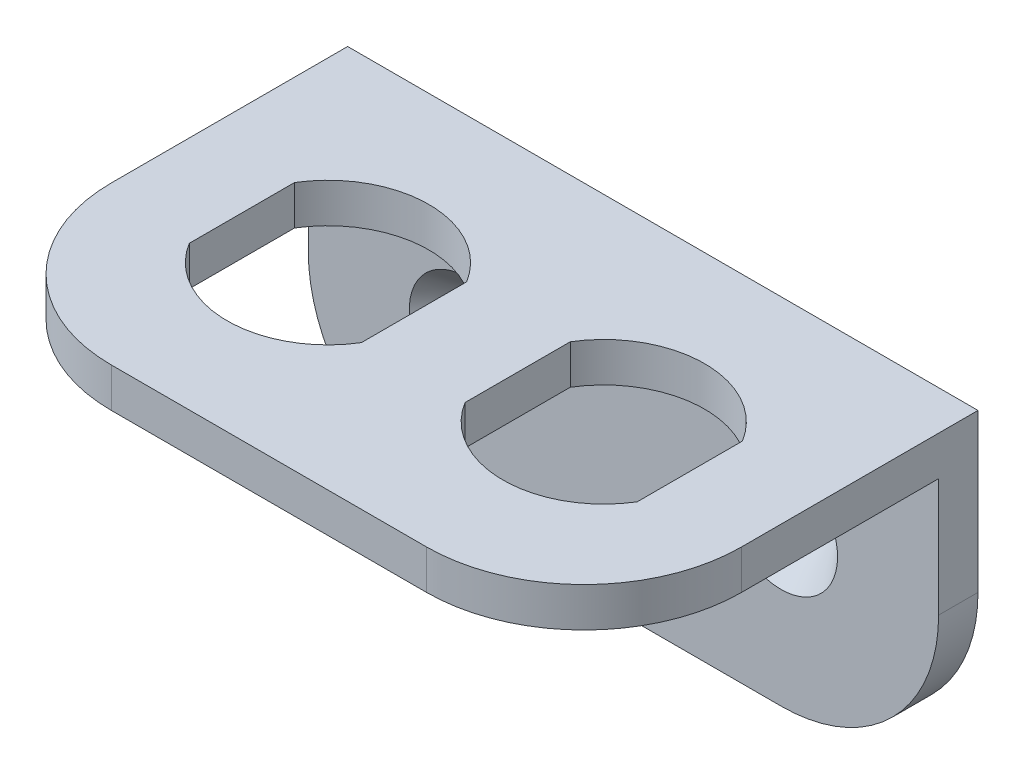
ISO-10303-21;
HEADER;
FILE_DESCRIPTION(('STEP AP214'),'2;1');
FILE_NAME('part.step','',(''),(''),'','','');
FILE_SCHEMA(('AUTOMOTIVE_DESIGN { 1 0 10303 214 1 1 1 1 }'));
ENDSEC;
DATA;
#1=APPLICATION_CONTEXT('core data for automotive mechanical design processes');
#2=APPLICATION_PROTOCOL_DEFINITION('international standard','automotive_design',2000,#1);
#3=PRODUCT_CONTEXT('',#1,'mechanical');
#4=PRODUCT('Part','Part','',(#3));
#5=PRODUCT_RELATED_PRODUCT_CATEGORY('part','',(#4));
#6=PRODUCT_DEFINITION_FORMATION('','',#4);
#7=PRODUCT_DEFINITION_CONTEXT('part definition',#1,'design');
#8=PRODUCT_DEFINITION('design','',#6,#7);
#9=PRODUCT_DEFINITION_SHAPE('','',#8);
#10=(LENGTH_UNIT() NAMED_UNIT(*) SI_UNIT(.MILLI.,.METRE.));
#11=(NAMED_UNIT(*) PLANE_ANGLE_UNIT() SI_UNIT($,.RADIAN.));
#12=(NAMED_UNIT(*) SI_UNIT($,.STERADIAN.) SOLID_ANGLE_UNIT());
#13=UNCERTAINTY_MEASURE_WITH_UNIT(LENGTH_MEASURE(1.E-05),#10,'distance_accuracy_value','');
#14=(GEOMETRIC_REPRESENTATION_CONTEXT(3) GLOBAL_UNCERTAINTY_ASSIGNED_CONTEXT((#13)) GLOBAL_UNIT_ASSIGNED_CONTEXT((#10,
#11,#12)) REPRESENTATION_CONTEXT('',''));
#15=CARTESIAN_POINT('',(0.,0.,0.));
#16=DIRECTION('',(0.,0.,1.));
#17=DIRECTION('',(1.,0.,0.));
#18=AXIS2_PLACEMENT_3D('',#15,#16,#17);
#19=CARTESIAN_POINT('',(50.8,-3.175,3.175));
#20=DIRECTION('',(0.,0.,-1.));
#21=DIRECTION('',(0.,1.,0.));
#22=AXIS2_PLACEMENT_3D('',#19,#20,#21);
#23=PLANE('',#22);
#24=CARTESIAN_POINT('',(38.1,-12.7000000000001,3.175));
#25=DIRECTION('',(0.,0.,1.));
#26=DIRECTION('',(1.,0.,0.));
#27=AXIS2_PLACEMENT_3D('',#24,#25,#26);
#28=CIRCLE('',#27,4.5593);
#29=CARTESIAN_POINT('',(42.6593,-12.7000000000001,3.175));
#30=VERTEX_POINT('',#29);
#31=EDGE_CURVE('E440',#30,#30,#28,.T.);
#32=ORIENTED_EDGE('',*,*,#31,.F.);
#33=EDGE_LOOP('',(#32));
#34=FACE_BOUND('',#33,.T.);
#35=DIRECTION('',(0.,-1.,0.));
#36=VECTOR('',#35,1.);
#37=CARTESIAN_POINT('',(0.,-3.175,3.175));
#38=LINE('',#37,#36);
#39=CARTESIAN_POINT('',(0.,-3.175,3.175));
#40=VERTEX_POINT('',#39);
#41=CARTESIAN_POINT('',(0.,-12.7,3.175));
#42=VERTEX_POINT('',#41);
#43=EDGE_CURVE('E220',#40,#42,#38,.T.);
#44=ORIENTED_EDGE('',*,*,#43,.T.);
#45=CARTESIAN_POINT('',(12.7,-12.7,3.175));
#46=DIRECTION('',(0.,0.,-1.));
#47=DIRECTION('',(0.,1.,0.));
#48=AXIS2_PLACEMENT_3D('',#45,#46,#47);
#49=CIRCLE('',#48,12.7);
#50=CARTESIAN_POINT('',(12.7,-25.4,3.175));
#51=VERTEX_POINT('',#50);
#52=EDGE_CURVE('E288',#42,#51,#49,.F.);
#53=ORIENTED_EDGE('',*,*,#52,.T.);
#54=DIRECTION('',(-1.,0.,0.));
#55=VECTOR('',#54,1.);
#56=CARTESIAN_POINT('',(50.8,-25.4,3.175));
#57=LINE('',#56,#55);
#58=CARTESIAN_POINT('',(38.1,-25.4,3.175));
#59=VERTEX_POINT('',#58);
#60=EDGE_CURVE('E238',#59,#51,#57,.T.);
#61=ORIENTED_EDGE('',*,*,#60,.F.);
#62=CARTESIAN_POINT('',(38.1,-12.7,3.175));
#63=DIRECTION('',(0.,0.,-1.));
#64=DIRECTION('',(0.,1.,0.));
#65=AXIS2_PLACEMENT_3D('',#62,#63,#64);
#66=CIRCLE('',#65,12.7);
#67=CARTESIAN_POINT('',(50.8,-12.7,3.175));
#68=VERTEX_POINT('',#67);
#69=EDGE_CURVE('E286',#59,#68,#66,.F.);
#70=ORIENTED_EDGE('',*,*,#69,.T.);
#71=DIRECTION('',(0.,-1.,0.));
#72=VECTOR('',#71,1.);
#73=CARTESIAN_POINT('',(50.8,-3.175,3.175));
#74=LINE('',#73,#72);
#75=CARTESIAN_POINT('',(50.8,-3.175,3.175));
#76=VERTEX_POINT('',#75);
#77=EDGE_CURVE('E225',#76,#68,#74,.T.);
#78=ORIENTED_EDGE('',*,*,#77,.F.);
#79=DIRECTION('',(-1.,0.,0.));
#80=VECTOR('',#79,1.);
#81=CARTESIAN_POINT('',(50.8,-3.175,3.175));
#82=LINE('',#81,#80);
#83=EDGE_CURVE('E241',#76,#40,#82,.T.);
#84=ORIENTED_EDGE('',*,*,#83,.T.);
#85=EDGE_LOOP('',(#44,#53,#61,#70,#78,#84));
#86=FACE_BOUND('',#85,.T.);
#87=CARTESIAN_POINT('',(12.7,-12.7000000000001,3.175));
#88=DIRECTION('',(0.,0.,1.));
#89=DIRECTION('',(1.,0.,0.));
#90=AXIS2_PLACEMENT_3D('',#87,#88,#89);
#91=CIRCLE('',#90,4.5593);
#92=CARTESIAN_POINT('',(17.2593,-12.7000000000001,3.175));
#93=VERTEX_POINT('',#92);
#94=EDGE_CURVE('E433',#93,#93,#91,.T.);
#95=ORIENTED_EDGE('',*,*,#94,.F.);
#96=EDGE_LOOP('',(#95));
#97=FACE_BOUND('',#96,.T.);
#98=ADVANCED_FACE('F36',(#34,#86,#97),#23,.F.);
#99=CARTESIAN_POINT('',(50.8,-25.4,0.));
#100=DIRECTION('',(0.,0.,1.));
#101=DIRECTION('',(1.,0.,0.));
#102=AXIS2_PLACEMENT_3D('',#99,#100,#101);
#103=PLANE('',#102);
#104=CARTESIAN_POINT('',(12.7,-12.7000000000001,0.));
#105=DIRECTION('',(0.,0.,1.));
#106=DIRECTION('',(1.,0.,0.));
#107=AXIS2_PLACEMENT_3D('',#104,#105,#106);
#108=CIRCLE('',#107,2.2479);
#109=CARTESIAN_POINT('',(14.9479,-12.7000000000001,0.));
#110=VERTEX_POINT('',#109);
#111=EDGE_CURVE('E435',#110,#110,#108,.T.);
#112=ORIENTED_EDGE('',*,*,#111,.T.);
#113=EDGE_LOOP('',(#112));
#114=FACE_BOUND('',#113,.T.);
#115=CARTESIAN_POINT('',(38.1,-12.7000000000001,0.));
#116=DIRECTION('',(0.,0.,1.));
#117=DIRECTION('',(1.,0.,0.));
#118=AXIS2_PLACEMENT_3D('',#115,#116,#117);
#119=CIRCLE('',#118,2.2479);
#120=CARTESIAN_POINT('',(40.3479,-12.7000000000001,0.));
#121=VERTEX_POINT('',#120);
#122=EDGE_CURVE('E446',#121,#121,#119,.T.);
#123=ORIENTED_EDGE('',*,*,#122,.T.);
#124=EDGE_LOOP('',(#123));
#125=FACE_BOUND('',#124,.T.);
#126=DIRECTION('',(-1.,0.,0.));
#127=VECTOR('',#126,1.);
#128=CARTESIAN_POINT('',(50.8,-25.4,0.));
#129=LINE('',#128,#127);
#130=CARTESIAN_POINT('',(38.1,-25.4,0.));
#131=VERTEX_POINT('',#130);
#132=CARTESIAN_POINT('',(12.7,-25.4,0.));
#133=VERTEX_POINT('',#132);
#134=EDGE_CURVE('E228',#131,#133,#129,.T.);
#135=ORIENTED_EDGE('',*,*,#134,.T.);
#136=CARTESIAN_POINT('',(12.7,-12.7,0.));
#137=DIRECTION('',(0.,0.,1.));
#138=DIRECTION('',(1.,0.,0.));
#139=AXIS2_PLACEMENT_3D('',#136,#137,#138);
#140=CIRCLE('',#139,12.7);
#141=CARTESIAN_POINT('',(0.,-12.7,0.));
#142=VERTEX_POINT('',#141);
#143=EDGE_CURVE('E280',#133,#142,#140,.F.);
#144=ORIENTED_EDGE('',*,*,#143,.T.);
#145=DIRECTION('',(0.,1.,0.));
#146=VECTOR('',#145,1.);
#147=CARTESIAN_POINT('',(0.,-25.4,0.));
#148=LINE('',#147,#146);
#149=CARTESIAN_POINT('',(0.,0.,0.));
#150=VERTEX_POINT('',#149);
#151=EDGE_CURVE('E210',#142,#150,#148,.T.);
#152=ORIENTED_EDGE('',*,*,#151,.T.);
#153=DIRECTION('',(-1.,0.,0.));
#154=VECTOR('',#153,1.);
#155=CARTESIAN_POINT('',(50.8,0.,0.));
#156=LINE('',#155,#154);
#157=CARTESIAN_POINT('',(50.8,0.,0.));
#158=VERTEX_POINT('',#157);
#159=EDGE_CURVE('E249',#158,#150,#156,.T.);
#160=ORIENTED_EDGE('',*,*,#159,.F.);
#161=DIRECTION('',(0.,1.,0.));
#162=VECTOR('',#161,1.);
#163=CARTESIAN_POINT('',(50.8,-25.4,0.));
#164=LINE('',#163,#162);
#165=CARTESIAN_POINT('',(50.8,-12.7,0.));
#166=VERTEX_POINT('',#165);
#167=EDGE_CURVE('E217',#166,#158,#164,.T.);
#168=ORIENTED_EDGE('',*,*,#167,.F.);
#169=CARTESIAN_POINT('',(38.1,-12.7,0.));
#170=DIRECTION('',(0.,0.,1.));
#171=DIRECTION('',(1.,0.,0.));
#172=AXIS2_PLACEMENT_3D('',#169,#170,#171);
#173=CIRCLE('',#172,12.7);
#174=EDGE_CURVE('E278',#166,#131,#173,.F.);
#175=ORIENTED_EDGE('',*,*,#174,.T.);
#176=EDGE_LOOP('',(#135,#144,#152,#160,#168,#175));
#177=FACE_BOUND('',#176,.T.);
#178=ADVANCED_FACE('F321',(#114,#125,#177),#103,.F.);
#179=CARTESIAN_POINT('',(50.8,0.,0.));
#180=DIRECTION('',(0.,-1.,0.));
#181=DIRECTION('',(0.,0.,-1.));
#182=AXIS2_PLACEMENT_3D('',#179,#180,#181);
#183=PLANE('',#182);
#184=DIRECTION('',(0.,0.,1.));
#185=VECTOR('',#184,1.);
#186=CARTESIAN_POINT('',(29.5783,0.,11.6345690832181));
#187=LINE('',#186,#185);
#188=CARTESIAN_POINT('',(29.5783,0.,11.6345690832181));
#189=VERTEX_POINT('',#188);
#190=CARTESIAN_POINT('',(29.5783,0.,20.1154309167819));
#191=VERTEX_POINT('',#190);
#192=EDGE_CURVE('E177',#189,#191,#187,.T.);
#193=ORIENTED_EDGE('',*,*,#192,.F.);
#194=CARTESIAN_POINT('',(36.5125,0.,15.875));
#195=DIRECTION('',(0.,1.,0.));
#196=DIRECTION('',(0.,0.,1.));
#197=AXIS2_PLACEMENT_3D('',#194,#195,#196);
#198=CIRCLE('',#197,8.128);
#199=CARTESIAN_POINT('',(43.4467,0.,11.6345690832181));
#200=VERTEX_POINT('',#199);
#201=EDGE_CURVE('E182',#200,#189,#198,.T.);
#202=ORIENTED_EDGE('',*,*,#201,.F.);
#203=DIRECTION('',(0.,0.,-1.));
#204=VECTOR('',#203,1.);
#205=CARTESIAN_POINT('',(43.4467,0.,11.6345690832181));
#206=LINE('',#205,#204);
#207=CARTESIAN_POINT('',(43.4467,0.,20.1154309167819));
#208=VERTEX_POINT('',#207);
#209=EDGE_CURVE('E187',#208,#200,#206,.T.);
#210=ORIENTED_EDGE('',*,*,#209,.F.);
#211=CARTESIAN_POINT('',(36.5125,0.,15.875));
#212=DIRECTION('',(0.,1.,0.));
#213=DIRECTION('',(0.,0.,1.));
#214=AXIS2_PLACEMENT_3D('',#211,#212,#213);
#215=CIRCLE('',#214,8.128);
#216=EDGE_CURVE('E166',#191,#208,#215,.T.);
#217=ORIENTED_EDGE('',*,*,#216,.F.);
#218=EDGE_LOOP('',(#193,#202,#210,#217));
#219=FACE_BOUND('',#218,.T.);
#220=DIRECTION('',(0.,0.,1.));
#221=VECTOR('',#220,1.);
#222=CARTESIAN_POINT('',(7.3533,0.,11.6345690832181));
#223=LINE('',#222,#221);
#224=CARTESIAN_POINT('',(7.3533,0.,11.6345690832181));
#225=VERTEX_POINT('',#224);
#226=CARTESIAN_POINT('',(7.3533,0.,20.1154309167819));
#227=VERTEX_POINT('',#226);
#228=EDGE_CURVE('E198',#225,#227,#223,.T.);
#229=ORIENTED_EDGE('',*,*,#228,.F.);
#230=CARTESIAN_POINT('',(14.2875,0.,15.875));
#231=DIRECTION('',(0.,1.,0.));
#232=DIRECTION('',(0.,0.,1.));
#233=AXIS2_PLACEMENT_3D('',#230,#231,#232);
#234=CIRCLE('',#233,8.128);
#235=CARTESIAN_POINT('',(21.2217,0.,11.6345690832181));
#236=VERTEX_POINT('',#235);
#237=EDGE_CURVE('E194',#236,#225,#234,.T.);
#238=ORIENTED_EDGE('',*,*,#237,.F.);
#239=DIRECTION('',(0.,0.,-1.));
#240=VECTOR('',#239,1.);
#241=CARTESIAN_POINT('',(21.2217,0.,11.6345690832181));
#242=LINE('',#241,#240);
#243=CARTESIAN_POINT('',(21.2217,0.,20.1154309167819));
#244=VERTEX_POINT('',#243);
#245=EDGE_CURVE('E204',#244,#236,#242,.T.);
#246=ORIENTED_EDGE('',*,*,#245,.F.);
#247=CARTESIAN_POINT('',(14.2875,0.,15.875));
#248=DIRECTION('',(0.,1.,0.));
#249=DIRECTION('',(0.,0.,1.));
#250=AXIS2_PLACEMENT_3D('',#247,#248,#249);
#251=CIRCLE('',#250,8.128);
#252=EDGE_CURVE('E201',#227,#244,#251,.T.);
#253=ORIENTED_EDGE('',*,*,#252,.F.);
#254=EDGE_LOOP('',(#229,#238,#246,#253));
#255=FACE_BOUND('',#254,.T.);
#256=DIRECTION('',(-1.,0.,0.));
#257=VECTOR('',#256,1.);
#258=CARTESIAN_POINT('',(50.8,0.,31.75));
#259=LINE('',#258,#257);
#260=CARTESIAN_POINT('',(38.1,0.,31.75));
#261=VERTEX_POINT('',#260);
#262=CARTESIAN_POINT('',(12.7,0.,31.75));
#263=VERTEX_POINT('',#262);
#264=EDGE_CURVE('E247',#261,#263,#259,.T.);
#265=ORIENTED_EDGE('',*,*,#264,.F.);
#266=CARTESIAN_POINT('',(38.1,0.,19.05));
#267=DIRECTION('',(0.,-1.,0.));
#268=DIRECTION('',(0.,0.,-1.));
#269=AXIS2_PLACEMENT_3D('',#266,#267,#268);
#270=CIRCLE('',#269,12.7);
#271=CARTESIAN_POINT('',(50.8,0.,19.05));
#272=VERTEX_POINT('',#271);
#273=EDGE_CURVE('E11',#261,#272,#270,.F.);
#274=ORIENTED_EDGE('',*,*,#273,.T.);
#275=DIRECTION('',(0.,0.,1.));
#276=VECTOR('',#275,1.);
#277=CARTESIAN_POINT('',(50.8,0.,0.));
#278=LINE('',#277,#276);
#279=EDGE_CURVE('E219',#158,#272,#278,.T.);
#280=ORIENTED_EDGE('',*,*,#279,.F.);
#281=ORIENTED_EDGE('',*,*,#159,.T.);
#282=DIRECTION('',(0.,0.,1.));
#283=VECTOR('',#282,1.);
#284=CARTESIAN_POINT('',(0.,0.,0.));
#285=LINE('',#284,#283);
#286=CARTESIAN_POINT('',(0.,0.,19.05));
#287=VERTEX_POINT('',#286);
#288=EDGE_CURVE('E230',#150,#287,#285,.T.);
#289=ORIENTED_EDGE('',*,*,#288,.T.);
#290=CARTESIAN_POINT('',(12.7,0.,19.05));
#291=DIRECTION('',(0.,-1.,0.));
#292=DIRECTION('',(0.,0.,-1.));
#293=AXIS2_PLACEMENT_3D('',#290,#291,#292);
#294=CIRCLE('',#293,12.7);
#295=EDGE_CURVE('E44',#287,#263,#294,.F.);
#296=ORIENTED_EDGE('',*,*,#295,.T.);
#297=EDGE_LOOP('',(#265,#274,#280,#281,#289,#296));
#298=FACE_BOUND('',#297,.T.);
#299=ADVANCED_FACE('F184',(#219,#255,#298),#183,.F.);
#300=CARTESIAN_POINT('',(50.8,0.,31.75));
#301=DIRECTION('',(0.,0.,-1.));
#302=DIRECTION('',(-1.,0.,0.));
#303=AXIS2_PLACEMENT_3D('',#300,#301,#302);
#304=PLANE('',#303);
#305=DIRECTION('',(-1.,0.,0.));
#306=VECTOR('',#305,1.);
#307=CARTESIAN_POINT('',(50.8,-3.175,31.75));
#308=LINE('',#307,#306);
#309=CARTESIAN_POINT('',(38.1,-3.175,31.75));
#310=VERTEX_POINT('',#309);
#311=CARTESIAN_POINT('',(12.7,-3.175,31.75));
#312=VERTEX_POINT('',#311);
#313=EDGE_CURVE('E244',#310,#312,#308,.T.);
#314=ORIENTED_EDGE('',*,*,#313,.F.);
#315=DIRECTION('',(0.,-1.,0.));
#316=VECTOR('',#315,1.);
#317=CARTESIAN_POINT('',(38.1,0.,31.75));
#318=LINE('',#317,#316);
#319=EDGE_CURVE('E57',#310,#261,#318,.F.);
#320=ORIENTED_EDGE('',*,*,#319,.T.);
#321=ORIENTED_EDGE('',*,*,#264,.T.);
#322=DIRECTION('',(0.,-1.,0.));
#323=VECTOR('',#322,1.);
#324=CARTESIAN_POINT('',(12.7,0.,31.75));
#325=LINE('',#324,#323);
#326=EDGE_CURVE('E300',#263,#312,#325,.T.);
#327=ORIENTED_EDGE('',*,*,#326,.T.);
#328=EDGE_LOOP('',(#314,#320,#321,#327));
#329=FACE_BOUND('',#328,.T.);
#330=ADVANCED_FACE('F304',(#329),#304,.F.);
#331=CARTESIAN_POINT('',(50.8,-3.175,31.75));
#332=DIRECTION('',(0.,1.,0.));
#333=DIRECTION('',(0.,0.,1.));
#334=AXIS2_PLACEMENT_3D('',#331,#332,#333);
#335=PLANE('',#334);
#336=DIRECTION('',(0.,0.,-1.));
#337=VECTOR('',#336,1.);
#338=CARTESIAN_POINT('',(43.4467,-3.175,31.75));
#339=LINE('',#338,#337);
#340=CARTESIAN_POINT('',(43.4467,-3.175,20.1154309167819));
#341=VERTEX_POINT('',#340);
#342=CARTESIAN_POINT('',(43.4467,-3.175,11.6345690832181));
#343=VERTEX_POINT('',#342);
#344=EDGE_CURVE('E267',#341,#343,#339,.T.);
#345=ORIENTED_EDGE('',*,*,#344,.T.);
#346=CARTESIAN_POINT('',(36.5125,-3.175,15.875));
#347=DIRECTION('',(0.,1.,0.));
#348=DIRECTION('',(0.,0.,1.));
#349=AXIS2_PLACEMENT_3D('',#346,#347,#348);
#350=CIRCLE('',#349,8.128);
#351=CARTESIAN_POINT('',(29.5783,-3.175,11.6345690832181));
#352=VERTEX_POINT('',#351);
#353=EDGE_CURVE('E270',#343,#352,#350,.T.);
#354=ORIENTED_EDGE('',*,*,#353,.T.);
#355=DIRECTION('',(0.,0.,1.));
#356=VECTOR('',#355,1.);
#357=CARTESIAN_POINT('',(29.5783,-3.175,31.75));
#358=LINE('',#357,#356);
#359=CARTESIAN_POINT('',(29.5783,-3.175,20.1154309167819));
#360=VERTEX_POINT('',#359);
#361=EDGE_CURVE('E264',#352,#360,#358,.T.);
#362=ORIENTED_EDGE('',*,*,#361,.T.);
#363=CARTESIAN_POINT('',(36.5125,-3.175,15.875));
#364=DIRECTION('',(0.,1.,0.));
#365=DIRECTION('',(0.,0.,1.));
#366=AXIS2_PLACEMENT_3D('',#363,#364,#365);
#367=CIRCLE('',#366,8.128);
#368=EDGE_CURVE('E169',#360,#341,#367,.T.);
#369=ORIENTED_EDGE('',*,*,#368,.T.);
#370=EDGE_LOOP('',(#345,#354,#362,#369));
#371=FACE_BOUND('',#370,.T.);
#372=DIRECTION('',(0.,0.,-1.));
#373=VECTOR('',#372,1.);
#374=CARTESIAN_POINT('',(21.2217,-3.175,31.75));
#375=LINE('',#374,#373);
#376=CARTESIAN_POINT('',(21.2217,-3.175,20.1154309167819));
#377=VERTEX_POINT('',#376);
#378=CARTESIAN_POINT('',(21.2217,-3.175,11.6345690832181));
#379=VERTEX_POINT('',#378);
#380=EDGE_CURVE('E258',#377,#379,#375,.T.);
#381=ORIENTED_EDGE('',*,*,#380,.T.);
#382=CARTESIAN_POINT('',(14.2875,-3.175,15.875));
#383=DIRECTION('',(0.,1.,0.));
#384=DIRECTION('',(0.,0.,1.));
#385=AXIS2_PLACEMENT_3D('',#382,#383,#384);
#386=CIRCLE('',#385,8.128);
#387=CARTESIAN_POINT('',(7.3533,-3.175,11.6345690832181));
#388=VERTEX_POINT('',#387);
#389=EDGE_CURVE('E261',#379,#388,#386,.T.);
#390=ORIENTED_EDGE('',*,*,#389,.T.);
#391=DIRECTION('',(0.,0.,1.));
#392=VECTOR('',#391,1.);
#393=CARTESIAN_POINT('',(7.3533,-3.175,31.75));
#394=LINE('',#393,#392);
#395=CARTESIAN_POINT('',(7.3533,-3.175,20.1154309167819));
#396=VERTEX_POINT('',#395);
#397=EDGE_CURVE('E252',#388,#396,#394,.T.);
#398=ORIENTED_EDGE('',*,*,#397,.T.);
#399=CARTESIAN_POINT('',(14.2875,-3.175,15.875));
#400=DIRECTION('',(0.,1.,0.));
#401=DIRECTION('',(0.,0.,1.));
#402=AXIS2_PLACEMENT_3D('',#399,#400,#401);
#403=CIRCLE('',#402,8.128);
#404=EDGE_CURVE('E255',#396,#377,#403,.T.);
#405=ORIENTED_EDGE('',*,*,#404,.T.);
#406=EDGE_LOOP('',(#381,#390,#398,#405));
#407=FACE_BOUND('',#406,.T.);
#408=DIRECTION('',(0.,0.,-1.));
#409=VECTOR('',#408,1.);
#410=CARTESIAN_POINT('',(50.8,-3.175,31.75));
#411=LINE('',#410,#409);
#412=CARTESIAN_POINT('',(50.8,-3.175,19.05));
#413=VERTEX_POINT('',#412);
#414=EDGE_CURVE('E223',#413,#76,#411,.T.);
#415=ORIENTED_EDGE('',*,*,#414,.F.);
#416=CARTESIAN_POINT('',(38.1,-3.175,19.05));
#417=DIRECTION('',(0.,1.,0.));
#418=DIRECTION('',(0.,0.,1.));
#419=AXIS2_PLACEMENT_3D('',#416,#417,#418);
#420=CIRCLE('',#419,12.7);
#421=EDGE_CURVE('E298',#413,#310,#420,.F.);
#422=ORIENTED_EDGE('',*,*,#421,.T.);
#423=ORIENTED_EDGE('',*,*,#313,.T.);
#424=CARTESIAN_POINT('',(12.7,-3.175,19.05));
#425=DIRECTION('',(0.,1.,0.));
#426=DIRECTION('',(0.,0.,1.));
#427=AXIS2_PLACEMENT_3D('',#424,#425,#426);
#428=CIRCLE('',#427,12.7);
#429=CARTESIAN_POINT('',(0.,-3.175,19.05));
#430=VERTEX_POINT('',#429);
#431=EDGE_CURVE('E296',#312,#430,#428,.F.);
#432=ORIENTED_EDGE('',*,*,#431,.T.);
#433=DIRECTION('',(0.,0.,-1.));
#434=VECTOR('',#433,1.);
#435=CARTESIAN_POINT('',(0.,-3.175,31.75));
#436=LINE('',#435,#434);
#437=EDGE_CURVE('E232',#430,#40,#436,.T.);
#438=ORIENTED_EDGE('',*,*,#437,.T.);
#439=ORIENTED_EDGE('',*,*,#83,.F.);
#440=EDGE_LOOP('',(#415,#422,#423,#432,#438,#439));
#441=FACE_BOUND('',#440,.T.);
#442=ADVANCED_FACE('F308',(#371,#407,#441),#335,.F.);
#443=CARTESIAN_POINT('',(50.8,-25.4,3.175));
#444=DIRECTION('',(0.,1.,0.));
#445=DIRECTION('',(0.,0.,1.));
#446=AXIS2_PLACEMENT_3D('',#443,#444,#445);
#447=PLANE('',#446);
#448=ORIENTED_EDGE('',*,*,#60,.T.);
#449=DIRECTION('',(0.,0.,-1.));
#450=VECTOR('',#449,1.);
#451=CARTESIAN_POINT('',(12.7,-25.4,3.175));
#452=LINE('',#451,#450);
#453=EDGE_CURVE('E275',#51,#133,#452,.T.);
#454=ORIENTED_EDGE('',*,*,#453,.T.);
#455=ORIENTED_EDGE('',*,*,#134,.F.);
#456=DIRECTION('',(0.,0.,-1.));
#457=VECTOR('',#456,1.);
#458=CARTESIAN_POINT('',(38.1,-25.4,3.175));
#459=LINE('',#458,#457);
#460=EDGE_CURVE('E273',#131,#59,#459,.F.);
#461=ORIENTED_EDGE('',*,*,#460,.T.);
#462=EDGE_LOOP('',(#448,#454,#455,#461));
#463=FACE_BOUND('',#462,.T.);
#464=ADVANCED_FACE('F350',(#463),#447,.F.);
#465=CARTESIAN_POINT('',(50.8,0.,0.));
#466=DIRECTION('',(1.,0.,0.));
#467=DIRECTION('',(0.,0.,-1.));
#468=AXIS2_PLACEMENT_3D('',#465,#466,#467);
#469=PLANE('',#468);
#470=ORIENTED_EDGE('',*,*,#77,.T.);
#471=DIRECTION('',(0.,0.,-1.));
#472=VECTOR('',#471,1.);
#473=CARTESIAN_POINT('',(50.8,-12.7,0.));
#474=LINE('',#473,#472);
#475=EDGE_CURVE('E293',#68,#166,#474,.T.);
#476=ORIENTED_EDGE('',*,*,#475,.T.);
#477=ORIENTED_EDGE('',*,*,#167,.T.);
#478=ORIENTED_EDGE('',*,*,#279,.T.);
#479=DIRECTION('',(0.,-1.,0.));
#480=VECTOR('',#479,1.);
#481=CARTESIAN_POINT('',(50.8,-3.175,19.05));
#482=LINE('',#481,#480);
#483=EDGE_CURVE('E290',#272,#413,#482,.T.);
#484=ORIENTED_EDGE('',*,*,#483,.T.);
#485=ORIENTED_EDGE('',*,*,#414,.T.);
#486=EDGE_LOOP('',(#470,#476,#477,#478,#484,#485));
#487=FACE_BOUND('',#486,.T.);
#488=ADVANCED_FACE('F316',(#487),#469,.T.);
#489=CARTESIAN_POINT('',(0.,0.,0.));
#490=DIRECTION('',(1.,0.,0.));
#491=DIRECTION('',(0.,0.,-1.));
#492=AXIS2_PLACEMENT_3D('',#489,#490,#491);
#493=PLANE('',#492);
#494=ORIENTED_EDGE('',*,*,#151,.F.);
#495=DIRECTION('',(0.,0.,-1.));
#496=VECTOR('',#495,1.);
#497=CARTESIAN_POINT('',(0.,-12.7,0.));
#498=LINE('',#497,#496);
#499=EDGE_CURVE('E284',#142,#42,#498,.F.);
#500=ORIENTED_EDGE('',*,*,#499,.T.);
#501=ORIENTED_EDGE('',*,*,#43,.F.);
#502=ORIENTED_EDGE('',*,*,#437,.F.);
#503=DIRECTION('',(0.,-1.,0.));
#504=VECTOR('',#503,1.);
#505=CARTESIAN_POINT('',(0.,0.,19.05));
#506=LINE('',#505,#504);
#507=EDGE_CURVE('E282',#430,#287,#506,.F.);
#508=ORIENTED_EDGE('',*,*,#507,.T.);
#509=ORIENTED_EDGE('',*,*,#288,.F.);
#510=EDGE_LOOP('',(#494,#500,#501,#502,#508,#509));
#511=FACE_BOUND('',#510,.T.);
#512=ADVANCED_FACE('F326',(#511),#493,.F.);
#513=CARTESIAN_POINT('',(14.2875,-25.4,15.875));
#514=DIRECTION('',(0.,1.,0.));
#515=DIRECTION('',(0.,0.,1.));
#516=AXIS2_PLACEMENT_3D('',#513,#514,#515);
#517=CYLINDRICAL_SURFACE('',#516,8.128);
#518=DIRECTION('',(0.,1.,0.));
#519=VECTOR('',#518,1.);
#520=CARTESIAN_POINT('',(21.2217,-25.4,11.6345690832181));
#521=LINE('',#520,#519);
#522=EDGE_CURVE('E208',#379,#236,#521,.T.);
#523=ORIENTED_EDGE('',*,*,#522,.T.);
#524=ORIENTED_EDGE('',*,*,#237,.T.);
#525=DIRECTION('',(0.,1.,0.));
#526=VECTOR('',#525,1.);
#527=CARTESIAN_POINT('',(7.3533,-25.4,11.6345690832181));
#528=LINE('',#527,#526);
#529=EDGE_CURVE('E207',#388,#225,#528,.T.);
#530=ORIENTED_EDGE('',*,*,#529,.F.);
#531=ORIENTED_EDGE('',*,*,#389,.F.);
#532=EDGE_LOOP('',(#523,#524,#530,#531));
#533=FACE_BOUND('',#532,.T.);
#534=ADVANCED_FACE('F386',(#533),#517,.F.);
#535=CARTESIAN_POINT('',(21.2217,-25.4,11.6345690832181));
#536=DIRECTION('',(1.,0.,0.));
#537=DIRECTION('',(0.,0.,-1.));
#538=AXIS2_PLACEMENT_3D('',#535,#536,#537);
#539=PLANE('',#538);
#540=DIRECTION('',(0.,1.,0.));
#541=VECTOR('',#540,1.);
#542=CARTESIAN_POINT('',(21.2217,-25.4,20.1154309167819));
#543=LINE('',#542,#541);
#544=EDGE_CURVE('E211',#377,#244,#543,.T.);
#545=ORIENTED_EDGE('',*,*,#544,.T.);
#546=ORIENTED_EDGE('',*,*,#245,.T.);
#547=ORIENTED_EDGE('',*,*,#522,.F.);
#548=ORIENTED_EDGE('',*,*,#380,.F.);
#549=EDGE_LOOP('',(#545,#546,#547,#548));
#550=FACE_BOUND('',#549,.T.);
#551=ADVANCED_FACE('F390',(#550),#539,.F.);
#552=CARTESIAN_POINT('',(14.2875,-25.4,15.875));
#553=DIRECTION('',(0.,1.,0.));
#554=DIRECTION('',(0.,0.,1.));
#555=AXIS2_PLACEMENT_3D('',#552,#553,#554);
#556=CYLINDRICAL_SURFACE('',#555,8.128);
#557=DIRECTION('',(0.,1.,0.));
#558=VECTOR('',#557,1.);
#559=CARTESIAN_POINT('',(7.3533,-25.4,20.1154309167819));
#560=LINE('',#559,#558);
#561=EDGE_CURVE('E213',#396,#227,#560,.T.);
#562=ORIENTED_EDGE('',*,*,#561,.T.);
#563=ORIENTED_EDGE('',*,*,#252,.T.);
#564=ORIENTED_EDGE('',*,*,#544,.F.);
#565=ORIENTED_EDGE('',*,*,#404,.F.);
#566=EDGE_LOOP('',(#562,#563,#564,#565));
#567=FACE_BOUND('',#566,.T.);
#568=ADVANCED_FACE('F396',(#567),#556,.F.);
#569=CARTESIAN_POINT('',(7.3533,-25.4,11.6345690832181));
#570=DIRECTION('',(-1.,0.,0.));
#571=DIRECTION('',(0.,0.,1.));
#572=AXIS2_PLACEMENT_3D('',#569,#570,#571);
#573=PLANE('',#572);
#574=ORIENTED_EDGE('',*,*,#529,.T.);
#575=ORIENTED_EDGE('',*,*,#228,.T.);
#576=ORIENTED_EDGE('',*,*,#561,.F.);
#577=ORIENTED_EDGE('',*,*,#397,.F.);
#578=EDGE_LOOP('',(#574,#575,#576,#577));
#579=FACE_BOUND('',#578,.T.);
#580=ADVANCED_FACE('F392',(#579),#573,.F.);
#581=CARTESIAN_POINT('',(36.5125,-25.4,15.875));
#582=DIRECTION('',(0.,1.,0.));
#583=DIRECTION('',(0.,0.,1.));
#584=AXIS2_PLACEMENT_3D('',#581,#582,#583);
#585=CYLINDRICAL_SURFACE('',#584,8.128);
#586=DIRECTION('',(0.,1.,0.));
#587=VECTOR('',#586,1.);
#588=CARTESIAN_POINT('',(43.4467,-25.4,11.6345690832181));
#589=LINE('',#588,#587);
#590=EDGE_CURVE('E192',#343,#200,#589,.T.);
#591=ORIENTED_EDGE('',*,*,#590,.T.);
#592=ORIENTED_EDGE('',*,*,#201,.T.);
#593=DIRECTION('',(0.,1.,0.));
#594=VECTOR('',#593,1.);
#595=CARTESIAN_POINT('',(29.5783,-25.4,11.6345690832181));
#596=LINE('',#595,#594);
#597=EDGE_CURVE('E173',#352,#189,#596,.T.);
#598=ORIENTED_EDGE('',*,*,#597,.F.);
#599=ORIENTED_EDGE('',*,*,#353,.F.);
#600=EDGE_LOOP('',(#591,#592,#598,#599));
#601=FACE_BOUND('',#600,.T.);
#602=ADVANCED_FACE('F395',(#601),#585,.F.);
#603=CARTESIAN_POINT('',(43.4467,-25.4,11.6345690832181));
#604=DIRECTION('',(1.,0.,0.));
#605=DIRECTION('',(0.,0.,-1.));
#606=AXIS2_PLACEMENT_3D('',#603,#604,#605);
#607=PLANE('',#606);
#608=DIRECTION('',(0.,1.,0.));
#609=VECTOR('',#608,1.);
#610=CARTESIAN_POINT('',(43.4467,-25.4,20.1154309167819));
#611=LINE('',#610,#609);
#612=EDGE_CURVE('E172',#341,#208,#611,.T.);
#613=ORIENTED_EDGE('',*,*,#612,.T.);
#614=ORIENTED_EDGE('',*,*,#209,.T.);
#615=ORIENTED_EDGE('',*,*,#590,.F.);
#616=ORIENTED_EDGE('',*,*,#344,.F.);
#617=EDGE_LOOP('',(#613,#614,#615,#616));
#618=FACE_BOUND('',#617,.T.);
#619=ADVANCED_FACE('F406',(#618),#607,.F.);
#620=CARTESIAN_POINT('',(36.5125,-25.4,15.875));
#621=DIRECTION('',(0.,1.,0.));
#622=DIRECTION('',(0.,0.,1.));
#623=AXIS2_PLACEMENT_3D('',#620,#621,#622);
#624=CYLINDRICAL_SURFACE('',#623,8.128);
#625=DIRECTION('',(0.,1.,0.));
#626=VECTOR('',#625,1.);
#627=CARTESIAN_POINT('',(29.5783,-25.4,20.1154309167819));
#628=LINE('',#627,#626);
#629=EDGE_CURVE('E161',#360,#191,#628,.T.);
#630=ORIENTED_EDGE('',*,*,#629,.T.);
#631=ORIENTED_EDGE('',*,*,#216,.T.);
#632=ORIENTED_EDGE('',*,*,#612,.F.);
#633=ORIENTED_EDGE('',*,*,#368,.F.);
#634=EDGE_LOOP('',(#630,#631,#632,#633));
#635=FACE_BOUND('',#634,.T.);
#636=ADVANCED_FACE('F163',(#635),#624,.F.);
#637=CARTESIAN_POINT('',(29.5783,-25.4,11.6345690832181));
#638=DIRECTION('',(-1.,0.,0.));
#639=DIRECTION('',(0.,0.,1.));
#640=AXIS2_PLACEMENT_3D('',#637,#638,#639);
#641=PLANE('',#640);
#642=ORIENTED_EDGE('',*,*,#597,.T.);
#643=ORIENTED_EDGE('',*,*,#192,.T.);
#644=ORIENTED_EDGE('',*,*,#629,.F.);
#645=ORIENTED_EDGE('',*,*,#361,.F.);
#646=EDGE_LOOP('',(#642,#643,#644,#645));
#647=FACE_BOUND('',#646,.T.);
#648=ADVANCED_FACE('F178',(#647),#641,.F.);
#649=CARTESIAN_POINT('',(12.7,-12.7,3.175));
#650=DIRECTION('',(0.,0.,-1.));
#651=DIRECTION('',(-1.,0.,0.));
#652=AXIS2_PLACEMENT_3D('',#649,#650,#651);
#653=CYLINDRICAL_SURFACE('',#652,12.7);
#654=ORIENTED_EDGE('',*,*,#52,.F.);
#655=ORIENTED_EDGE('',*,*,#499,.F.);
#656=ORIENTED_EDGE('',*,*,#143,.F.);
#657=ORIENTED_EDGE('',*,*,#453,.F.);
#658=EDGE_LOOP('',(#654,#655,#656,#657));
#659=FACE_BOUND('',#658,.T.);
#660=ADVANCED_FACE('F359',(#659),#653,.T.);
#661=CARTESIAN_POINT('',(38.1,-12.7,0.));
#662=DIRECTION('',(0.,0.,1.));
#663=DIRECTION('',(1.,0.,0.));
#664=AXIS2_PLACEMENT_3D('',#661,#662,#663);
#665=CYLINDRICAL_SURFACE('',#664,12.7);
#666=ORIENTED_EDGE('',*,*,#69,.F.);
#667=ORIENTED_EDGE('',*,*,#460,.F.);
#668=ORIENTED_EDGE('',*,*,#174,.F.);
#669=ORIENTED_EDGE('',*,*,#475,.F.);
#670=EDGE_LOOP('',(#666,#667,#668,#669));
#671=FACE_BOUND('',#670,.T.);
#672=ADVANCED_FACE('F337',(#671),#665,.T.);
#673=CARTESIAN_POINT('',(38.1,0.,19.05));
#674=DIRECTION('',(0.,1.,0.));
#675=DIRECTION('',(0.,0.,1.));
#676=AXIS2_PLACEMENT_3D('',#673,#674,#675);
#677=CYLINDRICAL_SURFACE('',#676,12.7);
#678=ORIENTED_EDGE('',*,*,#273,.F.);
#679=ORIENTED_EDGE('',*,*,#319,.F.);
#680=ORIENTED_EDGE('',*,*,#421,.F.);
#681=ORIENTED_EDGE('',*,*,#483,.F.);
#682=EDGE_LOOP('',(#678,#679,#680,#681));
#683=FACE_BOUND('',#682,.T.);
#684=ADVANCED_FACE('F314',(#683),#677,.T.);
#685=CARTESIAN_POINT('',(12.7,0.,19.05));
#686=DIRECTION('',(0.,-1.,0.));
#687=DIRECTION('',(0.,0.,-1.));
#688=AXIS2_PLACEMENT_3D('',#685,#686,#687);
#689=CYLINDRICAL_SURFACE('',#688,12.7);
#690=ORIENTED_EDGE('',*,*,#295,.F.);
#691=ORIENTED_EDGE('',*,*,#507,.F.);
#692=ORIENTED_EDGE('',*,*,#431,.F.);
#693=ORIENTED_EDGE('',*,*,#326,.F.);
#694=EDGE_LOOP('',(#690,#691,#692,#693));
#695=FACE_BOUND('',#694,.T.);
#696=ADVANCED_FACE('F38',(#695),#689,.T.);
#697=CARTESIAN_POINT('',(38.1,-12.7000000000001,3.175));
#698=DIRECTION('',(0.,0.,1.));
#699=DIRECTION('',(1.,0.,0.));
#700=AXIS2_PLACEMENT_3D('',#697,#698,#699);
#701=CYLINDRICAL_SURFACE('',#700,2.2479);
#702=ORIENTED_EDGE('',*,*,#122,.F.);
#703=EDGE_LOOP('',(#702));
#704=FACE_BOUND('',#703,.T.);
#705=CARTESIAN_POINT('',(38.1,-12.7000000000001,0.516038463549361));
#706=DIRECTION('',(0.,0.,1.));
#707=DIRECTION('',(1.,0.,0.));
#708=AXIS2_PLACEMENT_3D('',#705,#706,#707);
#709=CIRCLE('',#708,2.2479);
#710=CARTESIAN_POINT('',(40.3479,-12.7000000000001,0.516038463549361));
#711=VERTEX_POINT('',#710);
#712=EDGE_CURVE('E443',#711,#711,#709,.T.);
#713=ORIENTED_EDGE('',*,*,#712,.T.);
#714=EDGE_LOOP('',(#713));
#715=FACE_BOUND('',#714,.T.);
#716=ADVANCED_FACE('F329',(#704,#715),#701,.F.);
#717=CARTESIAN_POINT('',(38.1,-12.7000000000001,3.175));
#718=DIRECTION('',(0.,0.,1.));
#719=DIRECTION('',(1.,0.,0.));
#720=AXIS2_PLACEMENT_3D('',#717,#718,#719);
#721=CONICAL_SURFACE('',#720,4.5593,0.715584993317676);
#722=ORIENTED_EDGE('',*,*,#712,.F.);
#723=EDGE_LOOP('',(#722));
#724=FACE_BOUND('',#723,.T.);
#725=ORIENTED_EDGE('',*,*,#31,.T.);
#726=EDGE_LOOP('',(#725));
#727=FACE_BOUND('',#726,.T.);
#728=ADVANCED_FACE('F334',(#724,#727),#721,.F.);
#729=CARTESIAN_POINT('',(12.7,-12.7000000000001,3.175));
#730=DIRECTION('',(0.,0.,1.));
#731=DIRECTION('',(1.,0.,0.));
#732=AXIS2_PLACEMENT_3D('',#729,#730,#731);
#733=CYLINDRICAL_SURFACE('',#732,2.2479);
#734=ORIENTED_EDGE('',*,*,#111,.F.);
#735=EDGE_LOOP('',(#734));
#736=FACE_BOUND('',#735,.T.);
#737=CARTESIAN_POINT('',(12.7,-12.7000000000001,0.516038463549361));
#738=DIRECTION('',(0.,0.,1.));
#739=DIRECTION('',(1.,0.,0.));
#740=AXIS2_PLACEMENT_3D('',#737,#738,#739);
#741=CIRCLE('',#740,2.2479);
#742=CARTESIAN_POINT('',(14.9479,-12.7000000000001,0.516038463549361));
#743=VERTEX_POINT('',#742);
#744=EDGE_CURVE('E430',#743,#743,#741,.T.);
#745=ORIENTED_EDGE('',*,*,#744,.T.);
#746=EDGE_LOOP('',(#745));
#747=FACE_BOUND('',#746,.T.);
#748=ADVANCED_FACE('F417',(#736,#747),#733,.F.);
#749=CARTESIAN_POINT('',(12.7,-12.7000000000001,3.175));
#750=DIRECTION('',(0.,0.,1.));
#751=DIRECTION('',(1.,0.,0.));
#752=AXIS2_PLACEMENT_3D('',#749,#750,#751);
#753=CONICAL_SURFACE('',#752,4.5593,0.715584993317675);
#754=ORIENTED_EDGE('',*,*,#744,.F.);
#755=EDGE_LOOP('',(#754));
#756=FACE_BOUND('',#755,.T.);
#757=ORIENTED_EDGE('',*,*,#94,.T.);
#758=EDGE_LOOP('',(#757));
#759=FACE_BOUND('',#758,.T.);
#760=ADVANCED_FACE('F421',(#756,#759),#753,.F.);
#761=CLOSED_SHELL('',(#98,#178,#299,#330,#442,#464,#488,#512,#534,#551,#568,#580,#602,#619,#636,
#648,#660,#672,#684,#696,#716,#728,#748,#760));
#762=MANIFOLD_SOLID_BREP('B2',#761);
#763=ADVANCED_BREP_SHAPE_REPRESENTATION('',(#18,#762),#14);
#764=SHAPE_DEFINITION_REPRESENTATION(#9,#763);
ENDSEC;
END-ISO-10303-21;
